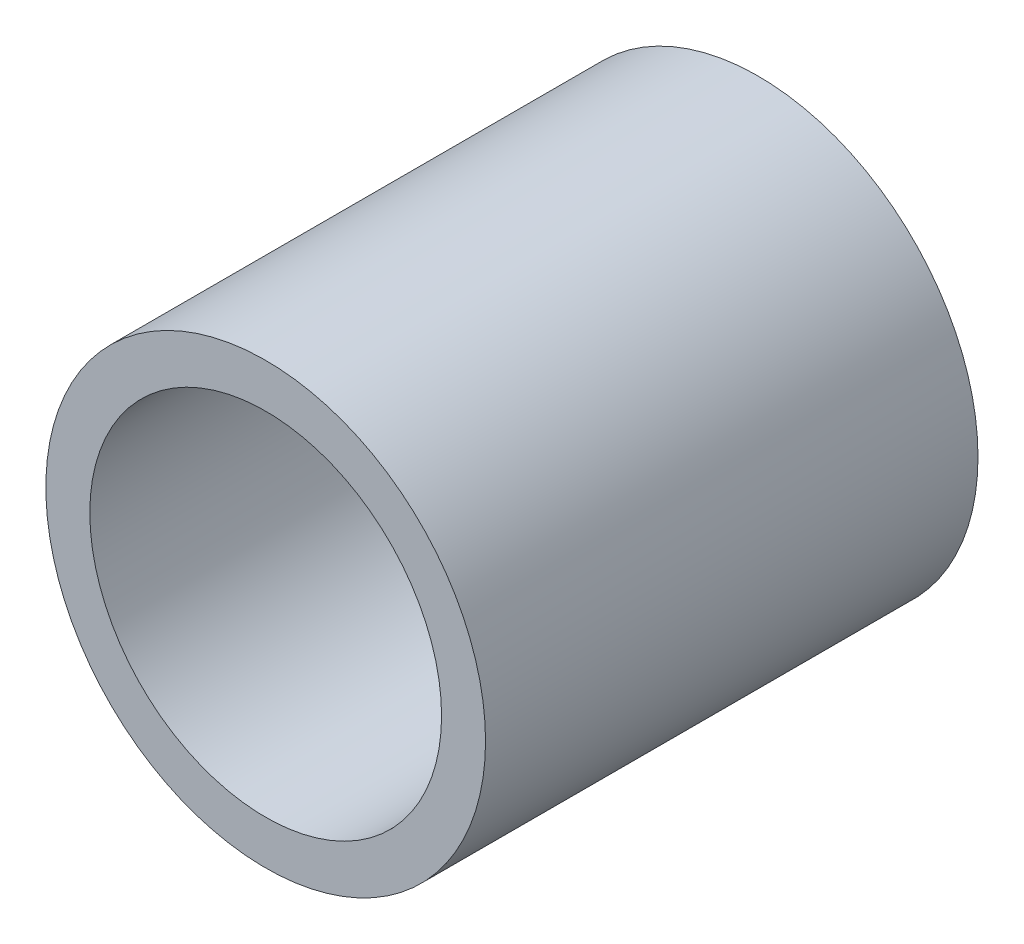
ISO-10303-21;
HEADER;
FILE_DESCRIPTION(('STEP AP214'),'2;1');
FILE_NAME('part.step','',(''),(''),'','','');
FILE_SCHEMA(('AUTOMOTIVE_DESIGN { 1 0 10303 214 1 1 1 1 }'));
ENDSEC;
DATA;
#1=APPLICATION_CONTEXT('core data for automotive mechanical design processes');
#2=APPLICATION_PROTOCOL_DEFINITION('international standard','automotive_design',2000,#1);
#3=PRODUCT_CONTEXT('',#1,'mechanical');
#4=PRODUCT('Part','Part','',(#3));
#5=PRODUCT_RELATED_PRODUCT_CATEGORY('part','',(#4));
#6=PRODUCT_DEFINITION_FORMATION('','',#4);
#7=PRODUCT_DEFINITION_CONTEXT('part definition',#1,'design');
#8=PRODUCT_DEFINITION('design','',#6,#7);
#9=PRODUCT_DEFINITION_SHAPE('','',#8);
#10=(LENGTH_UNIT() NAMED_UNIT(*) SI_UNIT(.MILLI.,.METRE.));
#11=(NAMED_UNIT(*) PLANE_ANGLE_UNIT() SI_UNIT($,.RADIAN.));
#12=(NAMED_UNIT(*) SI_UNIT($,.STERADIAN.) SOLID_ANGLE_UNIT());
#13=UNCERTAINTY_MEASURE_WITH_UNIT(LENGTH_MEASURE(1.E-05),#10,'distance_accuracy_value','');
#14=(GEOMETRIC_REPRESENTATION_CONTEXT(3) GLOBAL_UNCERTAINTY_ASSIGNED_CONTEXT((#13)) GLOBAL_UNIT_ASSIGNED_CONTEXT((#10,
#11,#12)) REPRESENTATION_CONTEXT('',''));
#15=CARTESIAN_POINT('',(0.,0.,0.));
#16=DIRECTION('',(0.,0.,1.));
#17=DIRECTION('',(1.,0.,0.));
#18=AXIS2_PLACEMENT_3D('',#15,#16,#17);
#19=CARTESIAN_POINT('',(0.,0.,-2.8));
#20=DIRECTION('',(0.,0.,1.));
#21=DIRECTION('',(1.,0.,0.));
#22=AXIS2_PLACEMENT_3D('',#19,#20,#21);
#23=CYLINDRICAL_SURFACE('',#22,1.25);
#24=CARTESIAN_POINT('',(0.,0.,-2.8));
#25=DIRECTION('',(0.,0.,1.));
#26=DIRECTION('',(1.,0.,0.));
#27=AXIS2_PLACEMENT_3D('',#24,#25,#26);
#28=CIRCLE('',#27,1.25);
#29=CARTESIAN_POINT('',(1.25,0.,-2.8));
#30=VERTEX_POINT('',#29);
#31=EDGE_CURVE('E10',#30,#30,#28,.T.);
#32=ORIENTED_EDGE('',*,*,#31,.T.);
#33=EDGE_LOOP('',(#32));
#34=FACE_BOUND('',#33,.T.);
#35=CARTESIAN_POINT('',(0.,0.,0.));
#36=DIRECTION('',(0.,0.,1.));
#37=DIRECTION('',(1.,0.,0.));
#38=AXIS2_PLACEMENT_3D('',#35,#36,#37);
#39=CIRCLE('',#38,1.25);
#40=CARTESIAN_POINT('',(1.25,0.,0.));
#41=VERTEX_POINT('',#40);
#42=EDGE_CURVE('E38',#41,#41,#39,.T.);
#43=ORIENTED_EDGE('',*,*,#42,.F.);
#44=EDGE_LOOP('',(#43));
#45=FACE_BOUND('',#44,.T.);
#46=ADVANCED_FACE('F35',(#34,#45),#23,.T.);
#47=CARTESIAN_POINT('',(0.,0.,-2.8));
#48=DIRECTION('',(0.,0.,1.));
#49=DIRECTION('',(1.,0.,0.));
#50=AXIS2_PLACEMENT_3D('',#47,#48,#49);
#51=PLANE('',#50);
#52=CARTESIAN_POINT('',(0.,0.,-2.8));
#53=DIRECTION('',(0.,0.,1.));
#54=DIRECTION('',(1.,0.,0.));
#55=AXIS2_PLACEMENT_3D('',#52,#53,#54);
#56=CIRCLE('',#55,1.);
#57=CARTESIAN_POINT('',(1.,0.,-2.8));
#58=VERTEX_POINT('',#57);
#59=EDGE_CURVE('E45',#58,#58,#56,.T.);
#60=ORIENTED_EDGE('',*,*,#59,.T.);
#61=EDGE_LOOP('',(#60));
#62=FACE_BOUND('',#61,.T.);
#63=ORIENTED_EDGE('',*,*,#31,.F.);
#64=EDGE_LOOP('',(#63));
#65=FACE_BOUND('',#64,.T.);
#66=ADVANCED_FACE('F53',(#62,#65),#51,.F.);
#67=CARTESIAN_POINT('',(0.,0.,0.));
#68=DIRECTION('',(0.,0.,1.));
#69=DIRECTION('',(1.,0.,0.));
#70=AXIS2_PLACEMENT_3D('',#67,#68,#69);
#71=PLANE('',#70);
#72=CARTESIAN_POINT('',(0.,0.,0.));
#73=DIRECTION('',(0.,0.,1.));
#74=DIRECTION('',(1.,0.,0.));
#75=AXIS2_PLACEMENT_3D('',#72,#73,#74);
#76=CIRCLE('',#75,1.);
#77=CARTESIAN_POINT('',(1.,0.,0.));
#78=VERTEX_POINT('',#77);
#79=EDGE_CURVE('E47',#78,#78,#76,.T.);
#80=ORIENTED_EDGE('',*,*,#79,.F.);
#81=EDGE_LOOP('',(#80));
#82=FACE_BOUND('',#81,.T.);
#83=ORIENTED_EDGE('',*,*,#42,.T.);
#84=EDGE_LOOP('',(#83));
#85=FACE_BOUND('',#84,.T.);
#86=ADVANCED_FACE('F59',(#82,#85),#71,.T.);
#87=CARTESIAN_POINT('',(0.,0.,-2.8));
#88=DIRECTION('',(0.,0.,1.));
#89=DIRECTION('',(1.,0.,0.));
#90=AXIS2_PLACEMENT_3D('',#87,#88,#89);
#91=CYLINDRICAL_SURFACE('',#90,1.);
#92=ORIENTED_EDGE('',*,*,#59,.F.);
#93=EDGE_LOOP('',(#92));
#94=FACE_BOUND('',#93,.T.);
#95=ORIENTED_EDGE('',*,*,#79,.T.);
#96=EDGE_LOOP('',(#95));
#97=FACE_BOUND('',#96,.T.);
#98=ADVANCED_FACE('F56',(#94,#97),#91,.F.);
#99=CLOSED_SHELL('',(#46,#66,#86,#98));
#100=MANIFOLD_SOLID_BREP('B2',#99);
#101=ADVANCED_BREP_SHAPE_REPRESENTATION('',(#18,#100),#14);
#102=SHAPE_DEFINITION_REPRESENTATION(#9,#101);
ENDSEC;
END-ISO-10303-21;
